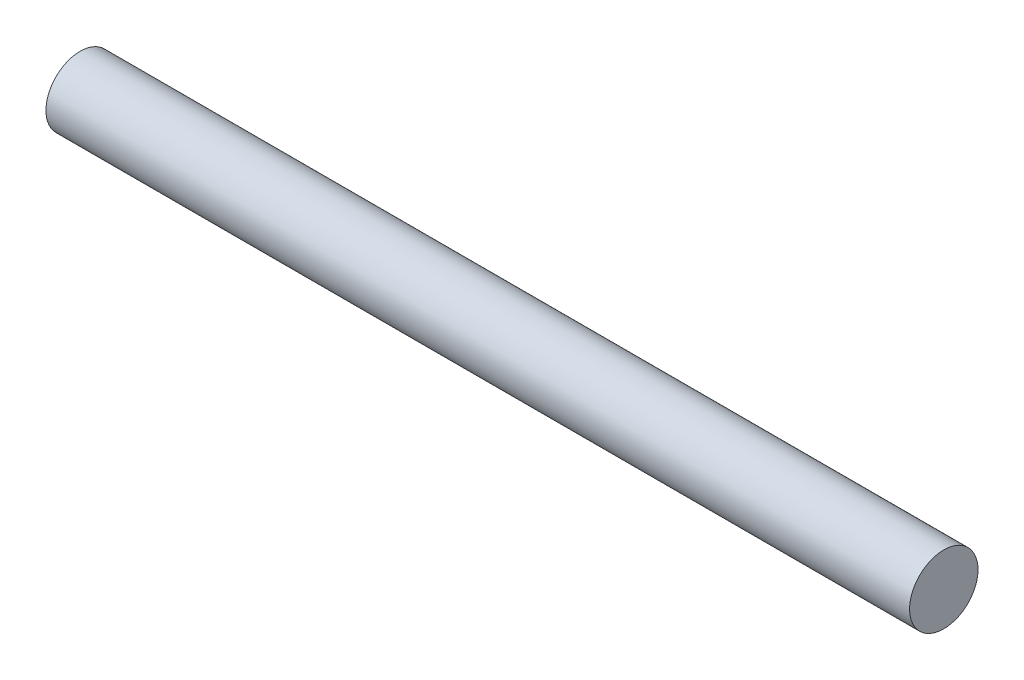
ISO-10303-21;
HEADER;
FILE_DESCRIPTION(('STEP AP214'),'2;1');
FILE_NAME('part.step','',(''),(''),'','','');
FILE_SCHEMA(('AUTOMOTIVE_DESIGN { 1 0 10303 214 1 1 1 1 }'));
ENDSEC;
DATA;
#1=APPLICATION_CONTEXT('core data for automotive mechanical design processes');
#2=APPLICATION_PROTOCOL_DEFINITION('international standard','automotive_design',2000,#1);
#3=PRODUCT_CONTEXT('',#1,'mechanical');
#4=PRODUCT('Part','Part','',(#3));
#5=PRODUCT_RELATED_PRODUCT_CATEGORY('part','',(#4));
#6=PRODUCT_DEFINITION_FORMATION('','',#4);
#7=PRODUCT_DEFINITION_CONTEXT('part definition',#1,'design');
#8=PRODUCT_DEFINITION('design','',#6,#7);
#9=PRODUCT_DEFINITION_SHAPE('','',#8);
#10=(LENGTH_UNIT() NAMED_UNIT(*) SI_UNIT(.MILLI.,.METRE.));
#11=(NAMED_UNIT(*) PLANE_ANGLE_UNIT() SI_UNIT($,.RADIAN.));
#12=(NAMED_UNIT(*) SI_UNIT($,.STERADIAN.) SOLID_ANGLE_UNIT());
#13=UNCERTAINTY_MEASURE_WITH_UNIT(LENGTH_MEASURE(1.E-05),#10,'distance_accuracy_value','');
#14=(GEOMETRIC_REPRESENTATION_CONTEXT(3) GLOBAL_UNCERTAINTY_ASSIGNED_CONTEXT((#13)) GLOBAL_UNIT_ASSIGNED_CONTEXT((#10,
#11,#12)) REPRESENTATION_CONTEXT('',''));
#15=CARTESIAN_POINT('',(0.,0.,0.));
#16=DIRECTION('',(0.,0.,1.));
#17=DIRECTION('',(1.,0.,0.));
#18=AXIS2_PLACEMENT_3D('',#15,#16,#17);
#19=CARTESIAN_POINT('',(101.,-56.3240567737451,12.4719059400976));
#20=DIRECTION('',(-1.,0.,0.));
#21=DIRECTION('',(0.,0.,1.));
#22=AXIS2_PLACEMENT_3D('',#19,#20,#21);
#23=CYLINDRICAL_SURFACE('',#22,4.00000000000002);
#24=CARTESIAN_POINT('',(101.,-56.3240567737451,12.4719059400976));
#25=DIRECTION('',(1.,0.,0.));
#26=DIRECTION('',(0.,0.,-1.));
#27=AXIS2_PLACEMENT_3D('',#24,#25,#26);
#28=CIRCLE('',#27,4.00000000000002);
#29=CARTESIAN_POINT('',(101.,-56.3240567737451,8.47190594009762));
#30=VERTEX_POINT('',#29);
#31=EDGE_CURVE('E12',#30,#30,#28,.T.);
#32=ORIENTED_EDGE('',*,*,#31,.F.);
#33=EDGE_LOOP('',(#32));
#34=FACE_BOUND('',#33,.T.);
#35=CARTESIAN_POINT('',(0.,-56.3240567737451,12.4719059400976));
#36=DIRECTION('',(1.,0.,0.));
#37=DIRECTION('',(0.,0.,-1.));
#38=AXIS2_PLACEMENT_3D('',#35,#36,#37);
#39=CIRCLE('',#38,4.00000000000002);
#40=CARTESIAN_POINT('',(0.,-56.3240567737451,8.47190594009762));
#41=VERTEX_POINT('',#40);
#42=EDGE_CURVE('E43',#41,#41,#39,.T.);
#43=ORIENTED_EDGE('',*,*,#42,.T.);
#44=EDGE_LOOP('',(#43));
#45=FACE_BOUND('',#44,.T.);
#46=ADVANCED_FACE('F40',(#34,#45),#23,.T.);
#47=CARTESIAN_POINT('',(101.,-56.3240567737451,12.4719059400976));
#48=DIRECTION('',(1.,0.,0.));
#49=DIRECTION('',(0.,0.,-1.));
#50=AXIS2_PLACEMENT_3D('',#47,#48,#49);
#51=PLANE('',#50);
#52=ORIENTED_EDGE('',*,*,#31,.T.);
#53=EDGE_LOOP('',(#52));
#54=FACE_BOUND('',#53,.T.);
#55=ADVANCED_FACE('F55',(#54),#51,.T.);
#56=CARTESIAN_POINT('',(0.,-56.3240567737451,12.4719059400976));
#57=DIRECTION('',(1.,0.,0.));
#58=DIRECTION('',(0.,0.,-1.));
#59=AXIS2_PLACEMENT_3D('',#56,#57,#58);
#60=PLANE('',#59);
#61=ORIENTED_EDGE('',*,*,#42,.F.);
#62=EDGE_LOOP('',(#61));
#63=FACE_BOUND('',#62,.T.);
#64=ADVANCED_FACE('F53',(#63),#60,.F.);
#65=CLOSED_SHELL('',(#46,#55,#64));
#66=MANIFOLD_SOLID_BREP('B2',#65);
#67=ADVANCED_BREP_SHAPE_REPRESENTATION('',(#18,#66),#14);
#68=SHAPE_DEFINITION_REPRESENTATION(#9,#67);
ENDSEC;
END-ISO-10303-21;
